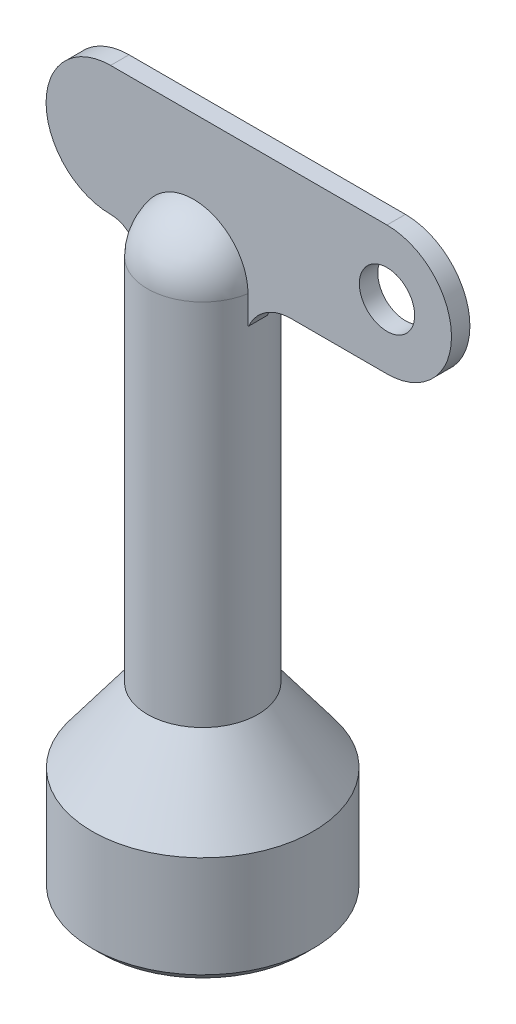
ISO-10303-21;
HEADER;
FILE_DESCRIPTION(('STEP AP214'),'2;1');
FILE_NAME('part.step','',(''),(''),'','','');
FILE_SCHEMA(('AUTOMOTIVE_DESIGN { 1 0 10303 214 1 1 1 1 }'));
ENDSEC;
DATA;
#1=APPLICATION_CONTEXT('core data for automotive mechanical design processes');
#2=APPLICATION_PROTOCOL_DEFINITION('international standard','automotive_design',2000,#1);
#3=PRODUCT_CONTEXT('',#1,'mechanical');
#4=PRODUCT('Part','Part','',(#3));
#5=PRODUCT_RELATED_PRODUCT_CATEGORY('part','',(#4));
#6=PRODUCT_DEFINITION_FORMATION('','',#4);
#7=PRODUCT_DEFINITION_CONTEXT('part definition',#1,'design');
#8=PRODUCT_DEFINITION('design','',#6,#7);
#9=PRODUCT_DEFINITION_SHAPE('','',#8);
#10=(LENGTH_UNIT() NAMED_UNIT(*) SI_UNIT(.MILLI.,.METRE.));
#11=(NAMED_UNIT(*) PLANE_ANGLE_UNIT() SI_UNIT($,.RADIAN.));
#12=(NAMED_UNIT(*) SI_UNIT($,.STERADIAN.) SOLID_ANGLE_UNIT());
#13=UNCERTAINTY_MEASURE_WITH_UNIT(LENGTH_MEASURE(1.E-05),#10,'distance_accuracy_value','');
#14=(GEOMETRIC_REPRESENTATION_CONTEXT(3) GLOBAL_UNCERTAINTY_ASSIGNED_CONTEXT((#13)) GLOBAL_UNIT_ASSIGNED_CONTEXT((#10,
#11,#12)) REPRESENTATION_CONTEXT('',''));
#15=CARTESIAN_POINT('',(0.,0.,0.));
#16=DIRECTION('',(0.,0.,1.));
#17=DIRECTION('',(1.,0.,0.));
#18=AXIS2_PLACEMENT_3D('',#15,#16,#17);
#19=CARTESIAN_POINT('',(0.,24.,0.));
#20=DIRECTION('',(0.,-1.,0.));
#21=DIRECTION('',(-1.,0.,0.));
#22=AXIS2_PLACEMENT_3D('',#19,#20,#21);
#23=SPHERICAL_SURFACE('',#22,3.);
#24=CARTESIAN_POINT('',(0.,24.,-0.5));
#25=DIRECTION('',(0.,0.,1.));
#26=DIRECTION('',(1.,0.,0.));
#27=AXIS2_PLACEMENT_3D('',#24,#25,#26);
#28=CIRCLE('',#27,2.95803989154981);
#29=CARTESIAN_POINT('',(2.95803989154981,24.,-0.5));
#30=VERTEX_POINT('',#29);
#31=CARTESIAN_POINT('',(-2.95803989154981,24.,-0.5));
#32=VERTEX_POINT('',#31);
#33=EDGE_CURVE('E353',#30,#32,#28,.T.);
#34=ORIENTED_EDGE('',*,*,#33,.F.);
#35=CARTESIAN_POINT('',(0.,24.,0.));
#36=DIRECTION('',(0.,1.,0.));
#37=DIRECTION('',(0.,0.,1.));
#38=AXIS2_PLACEMENT_3D('',#35,#36,#37);
#39=CIRCLE('',#38,3.);
#40=EDGE_CURVE('E306',#30,#32,#39,.T.);
#41=ORIENTED_EDGE('',*,*,#40,.T.);
#42=EDGE_LOOP('',(#34,#41));
#43=FACE_BOUND('',#42,.T.);
#44=ADVANCED_FACE('F39',(#43),#23,.T.);
#45=CARTESIAN_POINT('',(0.,-6.,0.));
#46=DIRECTION('',(0.,1.,0.));
#47=DIRECTION('',(0.,0.,1.));
#48=AXIS2_PLACEMENT_3D('',#45,#46,#47);
#49=CYLINDRICAL_SURFACE('',#48,6.);
#50=CARTESIAN_POINT('',(0.,-5.49999999999999,0.));
#51=DIRECTION('',(0.,1.,0.));
#52=DIRECTION('',(0.,0.,1.));
#53=AXIS2_PLACEMENT_3D('',#50,#51,#52);
#54=CIRCLE('',#53,6.);
#55=CARTESIAN_POINT('',(0.,-5.49999999999999,6.));
#56=VERTEX_POINT('',#55);
#57=EDGE_CURVE('E47',#56,#56,#54,.T.);
#58=ORIENTED_EDGE('',*,*,#57,.T.);
#59=EDGE_LOOP('',(#58));
#60=FACE_BOUND('',#59,.T.);
#61=CARTESIAN_POINT('',(0.,0.,0.));
#62=DIRECTION('',(0.,1.,0.));
#63=DIRECTION('',(0.,0.,1.));
#64=AXIS2_PLACEMENT_3D('',#61,#62,#63);
#65=CIRCLE('',#64,6.);
#66=CARTESIAN_POINT('',(0.,0.,6.));
#67=VERTEX_POINT('',#66);
#68=EDGE_CURVE('E349',#67,#67,#65,.T.);
#69=ORIENTED_EDGE('',*,*,#68,.F.);
#70=EDGE_LOOP('',(#69));
#71=FACE_BOUND('',#70,.T.);
#72=ADVANCED_FACE('F402',(#60,#71),#49,.T.);
#73=CARTESIAN_POINT('',(0.,-6.,0.));
#74=DIRECTION('',(0.,1.,0.));
#75=DIRECTION('',(0.,0.,1.));
#76=AXIS2_PLACEMENT_3D('',#73,#74,#75);
#77=PLANE('',#76);
#78=CARTESIAN_POINT('',(0.,-6.,0.));
#79=DIRECTION('',(0.,1.,0.));
#80=DIRECTION('',(0.,0.,1.));
#81=AXIS2_PLACEMENT_3D('',#78,#79,#80);
#82=CIRCLE('',#81,5.5);
#83=CARTESIAN_POINT('',(0.,-6.,5.5));
#84=VERTEX_POINT('',#83);
#85=EDGE_CURVE('E12',#84,#84,#82,.F.);
#86=ORIENTED_EDGE('',*,*,#85,.T.);
#87=EDGE_LOOP('',(#86));
#88=FACE_BOUND('',#87,.T.);
#89=DIRECTION('',(0.500000000000005,0.,-0.866025403784436));
#90=VECTOR('',#89,1.);
#91=CARTESIAN_POINT('',(2.59807621135332,-6.,1.50000000000002));
#92=LINE('',#91,#90);
#93=CARTESIAN_POINT('',(0.606217782649091,-6.,4.95000000000001));
#94=VERTEX_POINT('',#93);
#95=CARTESIAN_POINT('',(4.58993464005755,-6.,-1.94999999999997));
#96=VERTEX_POINT('',#95);
#97=EDGE_CURVE('E374',#94,#96,#92,.T.);
#98=ORIENTED_EDGE('',*,*,#97,.T.);
#99=CARTESIAN_POINT('',(3.98371685740843,-6.,-2.29999999999998));
#100=DIRECTION('',(0.,1.,0.));
#101=DIRECTION('',(0.,0.,1.));
#102=AXIS2_PLACEMENT_3D('',#99,#100,#101);
#103=CIRCLE('',#102,0.700000000000015);
#104=CARTESIAN_POINT('',(3.98371685740844,-6.,-2.99999999999999));
#105=VERTEX_POINT('',#104);
#106=EDGE_CURVE('E379',#96,#105,#103,.T.);
#107=ORIENTED_EDGE('',*,*,#106,.T.);
#108=DIRECTION('',(-1.,0.,0.));
#109=VECTOR('',#108,1.);
#110=CARTESIAN_POINT('',(0.,-6.,-3.00000000000002));
#111=LINE('',#110,#109);
#112=CARTESIAN_POINT('',(-3.9837168574084,-6.,-3.00000000000004));
#113=VERTEX_POINT('',#112);
#114=EDGE_CURVE('E376',#105,#113,#111,.T.);
#115=ORIENTED_EDGE('',*,*,#114,.T.);
#116=CARTESIAN_POINT('',(-3.98371685740841,-6.,-2.30000000000003));
#117=DIRECTION('',(0.,1.,0.));
#118=DIRECTION('',(0.,0.,1.));
#119=AXIS2_PLACEMENT_3D('',#116,#117,#118);
#120=CIRCLE('',#119,0.700000000000015);
#121=CARTESIAN_POINT('',(-4.58993464005753,-6.,-1.95000000000002));
#122=VERTEX_POINT('',#121);
#123=EDGE_CURVE('E370',#113,#122,#120,.T.);
#124=ORIENTED_EDGE('',*,*,#123,.T.);
#125=DIRECTION('',(0.499999999999995,0.,0.866025403784441));
#126=VECTOR('',#125,1.);
#127=CARTESIAN_POINT('',(-2.59807621135334,-6.,1.49999999999999));
#128=LINE('',#127,#126);
#129=CARTESIAN_POINT('',(-0.606217782649152,-6.,4.95));
#130=VERTEX_POINT('',#129);
#131=EDGE_CURVE('E368',#122,#130,#128,.T.);
#132=ORIENTED_EDGE('',*,*,#131,.T.);
#133=CARTESIAN_POINT('',(0.,-6.,4.6));
#134=DIRECTION('',(0.,1.,0.));
#135=DIRECTION('',(0.,0.,1.));
#136=AXIS2_PLACEMENT_3D('',#133,#134,#135);
#137=CIRCLE('',#136,0.700000000000015);
#138=EDGE_CURVE('E372',#130,#94,#137,.T.);
#139=ORIENTED_EDGE('',*,*,#138,.T.);
#140=EDGE_LOOP('',(#98,#107,#115,#124,#132,#139));
#141=FACE_BOUND('',#140,.T.);
#142=ADVANCED_FACE('F329',(#88,#141),#77,.F.);
#143=CARTESIAN_POINT('',(0.,4.,0.));
#144=DIRECTION('',(0.,-1.,0.));
#145=DIRECTION('',(0.,0.,-1.));
#146=AXIS2_PLACEMENT_3D('',#143,#144,#145);
#147=CONICAL_SURFACE('',#146,3.,0.643501108793284);
#148=CARTESIAN_POINT('',(0.,4.,0.));
#149=DIRECTION('',(0.,1.,0.));
#150=DIRECTION('',(0.,0.,1.));
#151=AXIS2_PLACEMENT_3D('',#148,#149,#150);
#152=CIRCLE('',#151,3.);
#153=CARTESIAN_POINT('',(0.,4.,3.));
#154=VERTEX_POINT('',#153);
#155=EDGE_CURVE('E311',#154,#154,#152,.T.);
#156=ORIENTED_EDGE('',*,*,#155,.F.);
#157=EDGE_LOOP('',(#156));
#158=FACE_BOUND('',#157,.T.);
#159=ORIENTED_EDGE('',*,*,#68,.T.);
#160=EDGE_LOOP('',(#159));
#161=FACE_BOUND('',#160,.T.);
#162=ADVANCED_FACE('F318',(#158,#161),#147,.T.);
#163=CARTESIAN_POINT('',(0.,24.,0.));
#164=DIRECTION('',(0.,-1.,0.));
#165=DIRECTION('',(0.,0.,-1.));
#166=AXIS2_PLACEMENT_3D('',#163,#164,#165);
#167=CYLINDRICAL_SURFACE('',#166,3.);
#168=CARTESIAN_POINT('',(-2.95803989154981,24.,0.5));
#169=VERTEX_POINT('',#168);
#170=CARTESIAN_POINT('',(2.95803989154981,24.,0.5));
#171=VERTEX_POINT('',#170);
#172=EDGE_CURVE('E303',#169,#171,#39,.T.);
#173=ORIENTED_EDGE('',*,*,#172,.F.);
#174=DIRECTION('',(0.,-1.,0.));
#175=VECTOR('',#174,1.);
#176=CARTESIAN_POINT('',(-2.95803989154981,24.,0.5));
#177=LINE('',#176,#175);
#178=CARTESIAN_POINT('',(-2.95803989154981,22.5,0.5));
#179=VERTEX_POINT('',#178);
#180=EDGE_CURVE('E301',#169,#179,#177,.T.);
#181=ORIENTED_EDGE('',*,*,#180,.T.);
#182=CARTESIAN_POINT('',(0.,22.5,0.));
#183=DIRECTION('',(0.,1.,0.));
#184=DIRECTION('',(0.,0.,1.));
#185=AXIS2_PLACEMENT_3D('',#182,#183,#184);
#186=CIRCLE('',#185,3.);
#187=CARTESIAN_POINT('',(-3.,22.5,0.));
#188=VERTEX_POINT('',#187);
#189=EDGE_CURVE('E362',#188,#179,#186,.T.);
#190=ORIENTED_EDGE('',*,*,#189,.F.);
#191=CARTESIAN_POINT('',(-2.95803989154981,22.5,-0.5));
#192=VERTEX_POINT('',#191);
#193=EDGE_CURVE('E448',#192,#188,#186,.T.);
#194=ORIENTED_EDGE('',*,*,#193,.F.);
#195=DIRECTION('',(0.,-1.,0.));
#196=VECTOR('',#195,1.);
#197=CARTESIAN_POINT('',(-2.95803989154981,24.,-0.5));
#198=LINE('',#197,#196);
#199=EDGE_CURVE('E296',#32,#192,#198,.T.);
#200=ORIENTED_EDGE('',*,*,#199,.F.);
#201=ORIENTED_EDGE('',*,*,#40,.F.);
#202=DIRECTION('',(0.,-1.,0.));
#203=VECTOR('',#202,1.);
#204=CARTESIAN_POINT('',(2.95803989154981,24.,-0.5));
#205=LINE('',#204,#203);
#206=CARTESIAN_POINT('',(2.95803989154981,22.5,-0.5));
#207=VERTEX_POINT('',#206);
#208=EDGE_CURVE('E293',#207,#30,#205,.F.);
#209=ORIENTED_EDGE('',*,*,#208,.F.);
#210=CARTESIAN_POINT('',(3.,22.5,0.));
#211=VERTEX_POINT('',#210);
#212=EDGE_CURVE('E358',#211,#207,#186,.T.);
#213=ORIENTED_EDGE('',*,*,#212,.F.);
#214=CARTESIAN_POINT('',(2.95803989154981,22.5,0.5));
#215=VERTEX_POINT('',#214);
#216=EDGE_CURVE('E361',#215,#211,#186,.T.);
#217=ORIENTED_EDGE('',*,*,#216,.F.);
#218=DIRECTION('',(0.,-1.,0.));
#219=VECTOR('',#218,1.);
#220=CARTESIAN_POINT('',(2.95803989154981,24.,0.5));
#221=LINE('',#220,#219);
#222=EDGE_CURVE('E299',#215,#171,#221,.F.);
#223=ORIENTED_EDGE('',*,*,#222,.T.);
#224=EDGE_LOOP('',(#173,#181,#190,#194,#200,#201,#209,#213,#217,#223));
#225=FACE_BOUND('',#224,.T.);
#226=ORIENTED_EDGE('',*,*,#155,.T.);
#227=EDGE_LOOP('',(#226));
#228=FACE_BOUND('',#227,.T.);
#229=ADVANCED_FACE('F328',(#225,#228),#167,.T.);
#230=ORIENTED_EDGE('',*,*,#172,.T.);
#231=CARTESIAN_POINT('',(0.,24.,0.5));
#232=DIRECTION('',(0.,0.,1.));
#233=DIRECTION('',(1.,0.,0.));
#234=AXIS2_PLACEMENT_3D('',#231,#232,#233);
#235=CIRCLE('',#234,2.95803989154981);
#236=EDGE_CURVE('E356',#171,#169,#235,.T.);
#237=ORIENTED_EDGE('',*,*,#236,.T.);
#238=EDGE_LOOP('',(#230,#237));
#239=FACE_BOUND('',#238,.T.);
#240=ADVANCED_FACE('F417',(#239),#23,.T.);
#241=CARTESIAN_POINT('',(-3.,22.5,0.5));
#242=DIRECTION('',(0.,1.,0.));
#243=DIRECTION('',(0.,0.,1.));
#244=AXIS2_PLACEMENT_3D('',#241,#242,#243);
#245=PLANE('',#244);
#246=DIRECTION('',(1.,0.,0.));
#247=VECTOR('',#246,1.);
#248=CARTESIAN_POINT('',(-3.,22.5,0.5));
#249=LINE('',#248,#247);
#250=CARTESIAN_POINT('',(3.,22.5,0.5));
#251=VERTEX_POINT('',#250);
#252=EDGE_CURVE('E241',#215,#251,#249,.T.);
#253=ORIENTED_EDGE('',*,*,#252,.F.);
#254=ORIENTED_EDGE('',*,*,#216,.T.);
#255=DIRECTION('',(0.,0.,-1.));
#256=VECTOR('',#255,1.);
#257=CARTESIAN_POINT('',(3.,22.5,0.5));
#258=LINE('',#257,#256);
#259=EDGE_CURVE('E283',#251,#211,#258,.T.);
#260=ORIENTED_EDGE('',*,*,#259,.F.);
#261=EDGE_LOOP('',(#253,#254,#260));
#262=FACE_BOUND('',#261,.T.);
#263=ADVANCED_FACE('F424',(#262),#245,.F.);
#264=CARTESIAN_POINT('',(3.,22.5,-0.5));
#265=VERTEX_POINT('',#264);
#266=EDGE_CURVE('E282',#211,#265,#258,.T.);
#267=ORIENTED_EDGE('',*,*,#266,.F.);
#268=ORIENTED_EDGE('',*,*,#212,.T.);
#269=DIRECTION('',(1.,0.,0.));
#270=VECTOR('',#269,1.);
#271=CARTESIAN_POINT('',(-3.,22.5,-0.5));
#272=LINE('',#271,#270);
#273=EDGE_CURVE('E260',#207,#265,#272,.T.);
#274=ORIENTED_EDGE('',*,*,#273,.T.);
#275=EDGE_LOOP('',(#267,#268,#274));
#276=FACE_BOUND('',#275,.T.);
#277=ADVANCED_FACE('F430',(#276),#245,.F.);
#278=CARTESIAN_POINT('',(-3.,22.5,-0.5));
#279=VERTEX_POINT('',#278);
#280=EDGE_CURVE('E261',#279,#192,#272,.T.);
#281=ORIENTED_EDGE('',*,*,#280,.T.);
#282=ORIENTED_EDGE('',*,*,#193,.T.);
#283=DIRECTION('',(0.,0.,-1.));
#284=VECTOR('',#283,1.);
#285=CARTESIAN_POINT('',(-3.,22.5,0.5));
#286=LINE('',#285,#284);
#287=EDGE_CURVE('E286',#188,#279,#286,.T.);
#288=ORIENTED_EDGE('',*,*,#287,.T.);
#289=EDGE_LOOP('',(#281,#282,#288));
#290=FACE_BOUND('',#289,.T.);
#291=ADVANCED_FACE('F485',(#290),#245,.F.);
#292=CARTESIAN_POINT('',(-4.5,27.5,0.5));
#293=DIRECTION('',(0.,0.,-1.));
#294=DIRECTION('',(-1.,0.,0.));
#295=AXIS2_PLACEMENT_3D('',#292,#293,#294);
#296=CYLINDRICAL_SURFACE('',#295,3.5);
#297=CARTESIAN_POINT('',(-4.5,27.5,-0.5));
#298=DIRECTION('',(0.,0.,1.));
#299=DIRECTION('',(1.,0.,0.));
#300=AXIS2_PLACEMENT_3D('',#297,#298,#299);
#301=CIRCLE('',#300,3.5);
#302=CARTESIAN_POINT('',(-4.5,31.,-0.5));
#303=VERTEX_POINT('',#302);
#304=CARTESIAN_POINT('',(-4.5,24.,-0.5));
#305=VERTEX_POINT('',#304);
#306=EDGE_CURVE('E254',#303,#305,#301,.T.);
#307=ORIENTED_EDGE('',*,*,#306,.T.);
#308=DIRECTION('',(0.,0.,-1.));
#309=VECTOR('',#308,1.);
#310=CARTESIAN_POINT('',(-4.5,24.,0.5));
#311=LINE('',#310,#309);
#312=CARTESIAN_POINT('',(-4.5,24.,0.5));
#313=VERTEX_POINT('',#312);
#314=EDGE_CURVE('E290',#313,#305,#311,.T.);
#315=ORIENTED_EDGE('',*,*,#314,.F.);
#316=CARTESIAN_POINT('',(-4.5,27.5,0.5));
#317=DIRECTION('',(0.,0.,1.));
#318=DIRECTION('',(1.,0.,0.));
#319=AXIS2_PLACEMENT_3D('',#316,#317,#318);
#320=CIRCLE('',#319,3.5);
#321=CARTESIAN_POINT('',(-4.5,31.,0.5));
#322=VERTEX_POINT('',#321);
#323=EDGE_CURVE('E235',#322,#313,#320,.T.);
#324=ORIENTED_EDGE('',*,*,#323,.F.);
#325=DIRECTION('',(0.,0.,-1.));
#326=VECTOR('',#325,1.);
#327=CARTESIAN_POINT('',(-4.5,31.,0.5));
#328=LINE('',#327,#326);
#329=EDGE_CURVE('E253',#322,#303,#328,.T.);
#330=ORIENTED_EDGE('',*,*,#329,.T.);
#331=EDGE_LOOP('',(#307,#315,#324,#330));
#332=FACE_BOUND('',#331,.T.);
#333=ADVANCED_FACE('F480',(#332),#296,.T.);
#334=CARTESIAN_POINT('',(-4.5,22.5,0.5));
#335=DIRECTION('',(0.,0.,-1.));
#336=DIRECTION('',(-1.,0.,0.));
#337=AXIS2_PLACEMENT_3D('',#334,#335,#336);
#338=CYLINDRICAL_SURFACE('',#337,1.5);
#339=CARTESIAN_POINT('',(-4.5,22.5,-0.5));
#340=DIRECTION('',(0.,0.,-1.));
#341=DIRECTION('',(1.,0.,0.));
#342=AXIS2_PLACEMENT_3D('',#339,#340,#341);
#343=CIRCLE('',#342,1.5);
#344=EDGE_CURVE('E257',#305,#279,#343,.T.);
#345=ORIENTED_EDGE('',*,*,#344,.T.);
#346=ORIENTED_EDGE('',*,*,#287,.F.);
#347=CARTESIAN_POINT('',(-3.,22.5,0.5));
#348=VERTEX_POINT('',#347);
#349=EDGE_CURVE('E287',#348,#188,#286,.T.);
#350=ORIENTED_EDGE('',*,*,#349,.F.);
#351=CARTESIAN_POINT('',(-4.5,22.5,0.5));
#352=DIRECTION('',(0.,0.,-1.));
#353=DIRECTION('',(1.,0.,0.));
#354=AXIS2_PLACEMENT_3D('',#351,#352,#353);
#355=CIRCLE('',#354,1.5);
#356=EDGE_CURVE('E238',#313,#348,#355,.T.);
#357=ORIENTED_EDGE('',*,*,#356,.F.);
#358=ORIENTED_EDGE('',*,*,#314,.T.);
#359=EDGE_LOOP('',(#345,#346,#350,#357,#358));
#360=FACE_BOUND('',#359,.T.);
#361=ADVANCED_FACE('F483',(#360),#338,.F.);
#362=ORIENTED_EDGE('',*,*,#349,.T.);
#363=ORIENTED_EDGE('',*,*,#189,.T.);
#364=EDGE_CURVE('E242',#348,#179,#249,.T.);
#365=ORIENTED_EDGE('',*,*,#364,.F.);
#366=EDGE_LOOP('',(#362,#363,#365));
#367=FACE_BOUND('',#366,.T.);
#368=ADVANCED_FACE('F433',(#367),#245,.F.);
#369=CARTESIAN_POINT('',(5.29128784747792,21.5,0.5));
#370=DIRECTION('',(0.,0.,-1.));
#371=DIRECTION('',(-1.,0.,0.));
#372=AXIS2_PLACEMENT_3D('',#369,#370,#371);
#373=CYLINDRICAL_SURFACE('',#372,2.5);
#374=CARTESIAN_POINT('',(5.29128784747792,21.5,-0.5));
#375=DIRECTION('',(0.,0.,-1.));
#376=DIRECTION('',(1.,0.,0.));
#377=AXIS2_PLACEMENT_3D('',#374,#375,#376);
#378=CIRCLE('',#377,2.5);
#379=CARTESIAN_POINT('',(5.29128784747792,24.,-0.5));
#380=VERTEX_POINT('',#379);
#381=EDGE_CURVE('E264',#265,#380,#378,.T.);
#382=ORIENTED_EDGE('',*,*,#381,.T.);
#383=DIRECTION('',(0.,0.,-1.));
#384=VECTOR('',#383,1.);
#385=CARTESIAN_POINT('',(5.29128784747792,24.,0.5));
#386=LINE('',#385,#384);
#387=CARTESIAN_POINT('',(5.29128784747792,24.,0.5));
#388=VERTEX_POINT('',#387);
#389=EDGE_CURVE('E279',#388,#380,#386,.T.);
#390=ORIENTED_EDGE('',*,*,#389,.F.);
#391=CARTESIAN_POINT('',(5.29128784747792,21.5,0.5));
#392=DIRECTION('',(0.,0.,-1.));
#393=DIRECTION('',(1.,0.,0.));
#394=AXIS2_PLACEMENT_3D('',#391,#392,#393);
#395=CIRCLE('',#394,2.5);
#396=EDGE_CURVE('E245',#251,#388,#395,.T.);
#397=ORIENTED_EDGE('',*,*,#396,.F.);
#398=ORIENTED_EDGE('',*,*,#259,.T.);
#399=ORIENTED_EDGE('',*,*,#266,.T.);
#400=EDGE_LOOP('',(#382,#390,#397,#398,#399));
#401=FACE_BOUND('',#400,.T.);
#402=ADVANCED_FACE('F460',(#401),#373,.F.);
#403=CARTESIAN_POINT('',(5.29128784747792,24.,0.5));
#404=DIRECTION('',(0.,1.,0.));
#405=DIRECTION('',(0.,0.,1.));
#406=AXIS2_PLACEMENT_3D('',#403,#404,#405);
#407=PLANE('',#406);
#408=DIRECTION('',(1.,0.,0.));
#409=VECTOR('',#408,1.);
#410=CARTESIAN_POINT('',(5.29128784747792,24.,-0.5));
#411=LINE('',#410,#409);
#412=CARTESIAN_POINT('',(10.5,24.,-0.5));
#413=VERTEX_POINT('',#412);
#414=EDGE_CURVE('E266',#380,#413,#411,.T.);
#415=ORIENTED_EDGE('',*,*,#414,.T.);
#416=DIRECTION('',(0.,0.,-1.));
#417=VECTOR('',#416,1.);
#418=CARTESIAN_POINT('',(10.5,24.,0.5));
#419=LINE('',#418,#417);
#420=CARTESIAN_POINT('',(10.5,24.,0.5));
#421=VERTEX_POINT('',#420);
#422=EDGE_CURVE('E276',#421,#413,#419,.T.);
#423=ORIENTED_EDGE('',*,*,#422,.F.);
#424=DIRECTION('',(1.,0.,0.));
#425=VECTOR('',#424,1.);
#426=CARTESIAN_POINT('',(5.29128784747792,24.,0.5));
#427=LINE('',#426,#425);
#428=EDGE_CURVE('E247',#388,#421,#427,.T.);
#429=ORIENTED_EDGE('',*,*,#428,.F.);
#430=ORIENTED_EDGE('',*,*,#389,.T.);
#431=EDGE_LOOP('',(#415,#423,#429,#430));
#432=FACE_BOUND('',#431,.T.);
#433=ADVANCED_FACE('F467',(#432),#407,.F.);
#434=CARTESIAN_POINT('',(10.5,27.5,0.5));
#435=DIRECTION('',(0.,0.,-1.));
#436=DIRECTION('',(-1.,0.,0.));
#437=AXIS2_PLACEMENT_3D('',#434,#435,#436);
#438=CYLINDRICAL_SURFACE('',#437,3.50000000000001);
#439=CARTESIAN_POINT('',(10.5,27.5,-0.5));
#440=DIRECTION('',(0.,0.,1.));
#441=DIRECTION('',(-1.,0.,0.));
#442=AXIS2_PLACEMENT_3D('',#439,#440,#441);
#443=CIRCLE('',#442,3.50000000000001);
#444=CARTESIAN_POINT('',(10.5,31.,-0.5));
#445=VERTEX_POINT('',#444);
#446=EDGE_CURVE('E268',#413,#445,#443,.T.);
#447=ORIENTED_EDGE('',*,*,#446,.T.);
#448=DIRECTION('',(0.,0.,-1.));
#449=VECTOR('',#448,1.);
#450=CARTESIAN_POINT('',(10.5,31.,0.5));
#451=LINE('',#450,#449);
#452=CARTESIAN_POINT('',(10.5,31.,0.5));
#453=VERTEX_POINT('',#452);
#454=EDGE_CURVE('E273',#453,#445,#451,.T.);
#455=ORIENTED_EDGE('',*,*,#454,.F.);
#456=CARTESIAN_POINT('',(10.5,27.5,0.5));
#457=DIRECTION('',(0.,0.,1.));
#458=DIRECTION('',(-1.,0.,0.));
#459=AXIS2_PLACEMENT_3D('',#456,#457,#458);
#460=CIRCLE('',#459,3.50000000000001);
#461=EDGE_CURVE('E249',#421,#453,#460,.T.);
#462=ORIENTED_EDGE('',*,*,#461,.F.);
#463=ORIENTED_EDGE('',*,*,#422,.T.);
#464=EDGE_LOOP('',(#447,#455,#462,#463));
#465=FACE_BOUND('',#464,.T.);
#466=ADVANCED_FACE('F471',(#465),#438,.T.);
#467=CARTESIAN_POINT('',(10.5,31.,0.5));
#468=DIRECTION('',(0.,-1.,0.));
#469=DIRECTION('',(1.,0.,0.));
#470=AXIS2_PLACEMENT_3D('',#467,#468,#469);
#471=PLANE('',#470);
#472=DIRECTION('',(-1.,0.,0.));
#473=VECTOR('',#472,1.);
#474=CARTESIAN_POINT('',(10.5,31.,-0.5));
#475=LINE('',#474,#473);
#476=EDGE_CURVE('E239',#445,#303,#475,.T.);
#477=ORIENTED_EDGE('',*,*,#476,.T.);
#478=ORIENTED_EDGE('',*,*,#329,.F.);
#479=DIRECTION('',(-1.,0.,0.));
#480=VECTOR('',#479,1.);
#481=CARTESIAN_POINT('',(10.5,31.,0.5));
#482=LINE('',#481,#480);
#483=EDGE_CURVE('E251',#453,#322,#482,.T.);
#484=ORIENTED_EDGE('',*,*,#483,.F.);
#485=ORIENTED_EDGE('',*,*,#454,.T.);
#486=EDGE_LOOP('',(#477,#478,#484,#485));
#487=FACE_BOUND('',#486,.T.);
#488=ADVANCED_FACE('F476',(#487),#471,.F.);
#489=CARTESIAN_POINT('',(-4.5,27.5,0.5));
#490=DIRECTION('',(0.,0.,1.));
#491=DIRECTION('',(1.,0.,0.));
#492=AXIS2_PLACEMENT_3D('',#489,#490,#491);
#493=PLANE('',#492);
#494=CARTESIAN_POINT('',(10.5,27.5,0.5));
#495=DIRECTION('',(0.,0.,1.));
#496=DIRECTION('',(1.,0.,0.));
#497=AXIS2_PLACEMENT_3D('',#494,#495,#496);
#498=CIRCLE('',#497,1.5);
#499=CARTESIAN_POINT('',(12.,27.5,0.5));
#500=VERTEX_POINT('',#499);
#501=EDGE_CURVE('E223',#500,#500,#498,.T.);
#502=ORIENTED_EDGE('',*,*,#501,.F.);
#503=EDGE_LOOP('',(#502));
#504=FACE_BOUND('',#503,.T.);
#505=ORIENTED_EDGE('',*,*,#180,.F.);
#506=ORIENTED_EDGE('',*,*,#236,.F.);
#507=ORIENTED_EDGE('',*,*,#222,.F.);
#508=ORIENTED_EDGE('',*,*,#252,.T.);
#509=ORIENTED_EDGE('',*,*,#396,.T.);
#510=ORIENTED_EDGE('',*,*,#428,.T.);
#511=ORIENTED_EDGE('',*,*,#461,.T.);
#512=ORIENTED_EDGE('',*,*,#483,.T.);
#513=ORIENTED_EDGE('',*,*,#323,.T.);
#514=ORIENTED_EDGE('',*,*,#356,.T.);
#515=ORIENTED_EDGE('',*,*,#364,.T.);
#516=EDGE_LOOP('',(#505,#506,#507,#508,#509,#510,#511,#512,#513,#514,#515));
#517=FACE_BOUND('',#516,.T.);
#518=ADVANCED_FACE('F440',(#504,#517),#493,.T.);
#519=CARTESIAN_POINT('',(-4.5,27.5,-0.5));
#520=DIRECTION('',(0.,0.,1.));
#521=DIRECTION('',(1.,0.,0.));
#522=AXIS2_PLACEMENT_3D('',#519,#520,#521);
#523=PLANE('',#522);
#524=CARTESIAN_POINT('',(10.5,27.5,-0.5));
#525=DIRECTION('',(0.,0.,1.));
#526=DIRECTION('',(1.,0.,0.));
#527=AXIS2_PLACEMENT_3D('',#524,#525,#526);
#528=CIRCLE('',#527,1.5);
#529=CARTESIAN_POINT('',(12.,27.5,-0.5));
#530=VERTEX_POINT('',#529);
#531=EDGE_CURVE('E234',#530,#530,#528,.T.);
#532=ORIENTED_EDGE('',*,*,#531,.T.);
#533=EDGE_LOOP('',(#532));
#534=FACE_BOUND('',#533,.T.);
#535=ORIENTED_EDGE('',*,*,#33,.T.);
#536=ORIENTED_EDGE('',*,*,#199,.T.);
#537=ORIENTED_EDGE('',*,*,#280,.F.);
#538=ORIENTED_EDGE('',*,*,#344,.F.);
#539=ORIENTED_EDGE('',*,*,#306,.F.);
#540=ORIENTED_EDGE('',*,*,#476,.F.);
#541=ORIENTED_EDGE('',*,*,#446,.F.);
#542=ORIENTED_EDGE('',*,*,#414,.F.);
#543=ORIENTED_EDGE('',*,*,#381,.F.);
#544=ORIENTED_EDGE('',*,*,#273,.F.);
#545=ORIENTED_EDGE('',*,*,#208,.T.);
#546=EDGE_LOOP('',(#535,#536,#537,#538,#539,#540,#541,#542,#543,#544,#545));
#547=FACE_BOUND('',#546,.T.);
#548=ADVANCED_FACE('F487',(#534,#547),#523,.F.);
#549=CARTESIAN_POINT('',(10.5,27.5,-6.0001));
#550=DIRECTION('',(0.,0.,1.));
#551=DIRECTION('',(1.,0.,0.));
#552=AXIS2_PLACEMENT_3D('',#549,#550,#551);
#553=CYLINDRICAL_SURFACE('',#552,1.5);
#554=ORIENTED_EDGE('',*,*,#501,.T.);
#555=EDGE_LOOP('',(#554));
#556=FACE_BOUND('',#555,.T.);
#557=ORIENTED_EDGE('',*,*,#531,.F.);
#558=EDGE_LOOP('',(#557));
#559=FACE_BOUND('',#558,.T.);
#560=ADVANCED_FACE('F491',(#556,#559),#553,.F.);
#561=CARTESIAN_POINT('',(3.98371685740843,-1.,-2.29999999999998));
#562=DIRECTION('',(0.,-1.,0.));
#563=DIRECTION('',(0.,0.,-1.));
#564=AXIS2_PLACEMENT_3D('',#561,#562,#563);
#565=CYLINDRICAL_SURFACE('',#564,0.2);
#566=DIRECTION('',(0.,-1.,0.));
#567=VECTOR('',#566,1.);
#568=CARTESIAN_POINT('',(3.98371685740843,-1.,-2.49999999999998));
#569=LINE('',#568,#567);
#570=CARTESIAN_POINT('',(3.98371685740843,-1.,-2.49999999999998));
#571=VERTEX_POINT('',#570);
#572=CARTESIAN_POINT('',(3.98371685740843,-5.71132486540518,-2.49999999999998));
#573=VERTEX_POINT('',#572);
#574=EDGE_CURVE('E221',#571,#573,#569,.T.);
#575=ORIENTED_EDGE('',*,*,#574,.T.);
#576=CARTESIAN_POINT('',(3.98371685740843,-5.71132486540518,-2.29999999999998));
#577=DIRECTION('',(0.,1.,0.));
#578=DIRECTION('',(0.,0.,1.));
#579=AXIS2_PLACEMENT_3D('',#576,#577,#578);
#580=CIRCLE('',#579,0.2);
#581=CARTESIAN_POINT('',(4.15692193816532,-5.71132486540518,-2.19999999999998));
#582=VERTEX_POINT('',#581);
#583=EDGE_CURVE('E191',#573,#582,#580,.F.);
#584=ORIENTED_EDGE('',*,*,#583,.T.);
#585=DIRECTION('',(0.,-1.,0.));
#586=VECTOR('',#585,1.);
#587=CARTESIAN_POINT('',(4.15692193816532,-1.,-2.19999999999998));
#588=LINE('',#587,#586);
#589=CARTESIAN_POINT('',(4.15692193816532,-1.,-2.19999999999998));
#590=VERTEX_POINT('',#589);
#591=EDGE_CURVE('E183',#590,#582,#588,.T.);
#592=ORIENTED_EDGE('',*,*,#591,.F.);
#593=CARTESIAN_POINT('',(3.98371685740843,-1.,-2.29999999999998));
#594=DIRECTION('',(0.,-1.,0.));
#595=DIRECTION('',(0.,0.,1.));
#596=AXIS2_PLACEMENT_3D('',#593,#594,#595);
#597=CIRCLE('',#596,0.2);
#598=EDGE_CURVE('E188',#571,#590,#597,.T.);
#599=ORIENTED_EDGE('',*,*,#598,.F.);
#600=EDGE_LOOP('',(#575,#584,#592,#599));
#601=FACE_BOUND('',#600,.T.);
#602=ADVANCED_FACE('F186',(#601),#565,.F.);
#603=CARTESIAN_POINT('',(-3.98371685740841,-1.,-2.50000000000003));
#604=DIRECTION('',(0.,0.,-1.));
#605=DIRECTION('',(-1.,0.,0.));
#606=AXIS2_PLACEMENT_3D('',#603,#604,#605);
#607=PLANE('',#606);
#608=DIRECTION('',(0.,-1.,0.));
#609=VECTOR('',#608,1.);
#610=CARTESIAN_POINT('',(-3.98371685740841,-1.,-2.50000000000003));
#611=LINE('',#610,#609);
#612=CARTESIAN_POINT('',(-3.98371685740841,-1.,-2.50000000000003));
#613=VERTEX_POINT('',#612);
#614=CARTESIAN_POINT('',(-3.98371685740841,-5.71132486540518,-2.50000000000003));
#615=VERTEX_POINT('',#614);
#616=EDGE_CURVE('E224',#613,#615,#611,.T.);
#617=ORIENTED_EDGE('',*,*,#616,.T.);
#618=DIRECTION('',(1.,0.,0.));
#619=VECTOR('',#618,1.);
#620=CARTESIAN_POINT('',(-3.98371685740841,-5.71132486540518,-2.50000000000003));
#621=LINE('',#620,#619);
#622=EDGE_CURVE('E365',#615,#573,#621,.T.);
#623=ORIENTED_EDGE('',*,*,#622,.T.);
#624=ORIENTED_EDGE('',*,*,#574,.F.);
#625=DIRECTION('',(1.,0.,0.));
#626=VECTOR('',#625,1.);
#627=CARTESIAN_POINT('',(-3.98371685740841,-1.,-2.50000000000003));
#628=LINE('',#627,#626);
#629=EDGE_CURVE('E195',#613,#571,#628,.T.);
#630=ORIENTED_EDGE('',*,*,#629,.F.);
#631=EDGE_LOOP('',(#617,#623,#624,#630));
#632=FACE_BOUND('',#631,.T.);
#633=ADVANCED_FACE('F652',(#632),#607,.F.);
#634=CARTESIAN_POINT('',(-3.98371685740841,-1.,-2.30000000000003));
#635=DIRECTION('',(0.,-1.,0.));
#636=DIRECTION('',(0.,0.,-1.));
#637=AXIS2_PLACEMENT_3D('',#634,#635,#636);
#638=CYLINDRICAL_SURFACE('',#637,0.2);
#639=DIRECTION('',(0.,-1.,0.));
#640=VECTOR('',#639,1.);
#641=CARTESIAN_POINT('',(-4.1569219381653,-1.,-2.20000000000003));
#642=LINE('',#641,#640);
#643=CARTESIAN_POINT('',(-4.1569219381653,-1.,-2.20000000000003));
#644=VERTEX_POINT('',#643);
#645=CARTESIAN_POINT('',(-4.1569219381653,-5.71132486540518,-2.20000000000003));
#646=VERTEX_POINT('',#645);
#647=EDGE_CURVE('E227',#644,#646,#642,.T.);
#648=ORIENTED_EDGE('',*,*,#647,.T.);
#649=CARTESIAN_POINT('',(-3.98371685740841,-5.71132486540518,-2.30000000000003));
#650=DIRECTION('',(0.,1.,0.));
#651=DIRECTION('',(0.,0.,1.));
#652=AXIS2_PLACEMENT_3D('',#649,#650,#651);
#653=CIRCLE('',#652,0.2);
#654=EDGE_CURVE('E385',#646,#615,#653,.F.);
#655=ORIENTED_EDGE('',*,*,#654,.T.);
#656=ORIENTED_EDGE('',*,*,#616,.F.);
#657=CARTESIAN_POINT('',(-3.98371685740841,-1.,-2.30000000000003));
#658=DIRECTION('',(0.,-1.,0.));
#659=DIRECTION('',(0.,0.,1.));
#660=AXIS2_PLACEMENT_3D('',#657,#658,#659);
#661=CIRCLE('',#660,0.2);
#662=EDGE_CURVE('E218',#644,#613,#661,.T.);
#663=ORIENTED_EDGE('',*,*,#662,.F.);
#664=EDGE_LOOP('',(#648,#655,#656,#663));
#665=FACE_BOUND('',#664,.T.);
#666=ADVANCED_FACE('F643',(#665),#638,.F.);
#667=CARTESIAN_POINT('',(-0.173205080756916,-1.,4.7));
#668=DIRECTION('',(-0.866025403784442,0.,0.499999999999995));
#669=DIRECTION('',(0.499999999999995,0.,0.866025403784442));
#670=AXIS2_PLACEMENT_3D('',#667,#668,#669);
#671=PLANE('',#670);
#672=DIRECTION('',(0.,-1.,0.));
#673=VECTOR('',#672,1.);
#674=CARTESIAN_POINT('',(-0.173205080756916,-1.,4.7));
#675=LINE('',#674,#673);
#676=CARTESIAN_POINT('',(-0.173205080756916,-1.,4.7));
#677=VERTEX_POINT('',#676);
#678=CARTESIAN_POINT('',(-0.173205080756916,-5.71132486540518,4.7));
#679=VERTEX_POINT('',#678);
#680=EDGE_CURVE('E229',#677,#679,#675,.T.);
#681=ORIENTED_EDGE('',*,*,#680,.T.);
#682=DIRECTION('',(-0.499999999999995,0.,-0.866025403784442));
#683=VECTOR('',#682,1.);
#684=CARTESIAN_POINT('',(-0.173205080756916,-5.71132486540518,4.7));
#685=LINE('',#684,#683);
#686=EDGE_CURVE('E54',#679,#646,#685,.T.);
#687=ORIENTED_EDGE('',*,*,#686,.T.);
#688=ORIENTED_EDGE('',*,*,#647,.F.);
#689=DIRECTION('',(-0.499999999999995,0.,-0.866025403784442));
#690=VECTOR('',#689,1.);
#691=CARTESIAN_POINT('',(-0.173205080756916,-1.,4.7));
#692=LINE('',#691,#690);
#693=EDGE_CURVE('E215',#677,#644,#692,.T.);
#694=ORIENTED_EDGE('',*,*,#693,.F.);
#695=EDGE_LOOP('',(#681,#687,#688,#694));
#696=FACE_BOUND('',#695,.T.);
#697=ADVANCED_FACE('F634',(#696),#671,.F.);
#698=CARTESIAN_POINT('',(0.,-1.,4.6));
#699=DIRECTION('',(0.,-1.,0.));
#700=DIRECTION('',(0.,0.,-1.));
#701=AXIS2_PLACEMENT_3D('',#698,#699,#700);
#702=CYLINDRICAL_SURFACE('',#701,0.199999999999999);
#703=DIRECTION('',(0.,-1.,0.));
#704=VECTOR('',#703,1.);
#705=CARTESIAN_POINT('',(0.17320508075686,-1.,4.7));
#706=LINE('',#705,#704);
#707=CARTESIAN_POINT('',(0.17320508075686,-1.,4.7));
#708=VERTEX_POINT('',#707);
#709=CARTESIAN_POINT('',(0.17320508075686,-5.71132486540518,4.7));
#710=VERTEX_POINT('',#709);
#711=EDGE_CURVE('E194',#708,#710,#706,.T.);
#712=ORIENTED_EDGE('',*,*,#711,.T.);
#713=CARTESIAN_POINT('',(0.,-5.71132486540518,4.6));
#714=DIRECTION('',(0.,1.,0.));
#715=DIRECTION('',(0.,0.,1.));
#716=AXIS2_PLACEMENT_3D('',#713,#714,#715);
#717=CIRCLE('',#716,0.199999999999999);
#718=EDGE_CURVE('E62',#710,#679,#717,.F.);
#719=ORIENTED_EDGE('',*,*,#718,.T.);
#720=ORIENTED_EDGE('',*,*,#680,.F.);
#721=CARTESIAN_POINT('',(0.,-1.,4.6));
#722=DIRECTION('',(0.,-1.,0.));
#723=DIRECTION('',(0.,0.,-1.));
#724=AXIS2_PLACEMENT_3D('',#721,#722,#723);
#725=CIRCLE('',#724,0.199999999999999);
#726=EDGE_CURVE('E203',#708,#677,#725,.T.);
#727=ORIENTED_EDGE('',*,*,#726,.F.);
#728=EDGE_LOOP('',(#712,#719,#720,#727));
#729=FACE_BOUND('',#728,.T.);
#730=ADVANCED_FACE('F625',(#729),#702,.F.);
#731=CARTESIAN_POINT('',(4.15692193816532,-1.,-2.19999999999998));
#732=DIRECTION('',(0.866025403784436,0.,0.500000000000005));
#733=DIRECTION('',(0.500000000000005,0.,-0.866025403784436));
#734=AXIS2_PLACEMENT_3D('',#731,#732,#733);
#735=PLANE('',#734);
#736=ORIENTED_EDGE('',*,*,#591,.T.);
#737=DIRECTION('',(-0.500000000000005,0.,0.866025403784436));
#738=VECTOR('',#737,1.);
#739=CARTESIAN_POINT('',(4.15692193816532,-5.71132486540518,-2.19999999999998));
#740=LINE('',#739,#738);
#741=EDGE_CURVE('E381',#582,#710,#740,.T.);
#742=ORIENTED_EDGE('',*,*,#741,.T.);
#743=ORIENTED_EDGE('',*,*,#711,.F.);
#744=DIRECTION('',(-0.500000000000005,0.,0.866025403784436));
#745=VECTOR('',#744,1.);
#746=CARTESIAN_POINT('',(4.15692193816532,-1.,-2.19999999999998));
#747=LINE('',#746,#745);
#748=EDGE_CURVE('E198',#590,#708,#747,.T.);
#749=ORIENTED_EDGE('',*,*,#748,.F.);
#750=EDGE_LOOP('',(#736,#742,#743,#749));
#751=FACE_BOUND('',#750,.T.);
#752=ADVANCED_FACE('F199',(#751),#735,.F.);
#753=CARTESIAN_POINT('',(3.98371685740843,-1.,-2.29999999999998));
#754=DIRECTION('',(0.,1.,0.));
#755=DIRECTION('',(0.,0.,1.));
#756=AXIS2_PLACEMENT_3D('',#753,#754,#755);
#757=PLANE('',#756);
#758=ORIENTED_EDGE('',*,*,#598,.T.);
#759=ORIENTED_EDGE('',*,*,#748,.T.);
#760=ORIENTED_EDGE('',*,*,#726,.T.);
#761=ORIENTED_EDGE('',*,*,#693,.T.);
#762=ORIENTED_EDGE('',*,*,#662,.T.);
#763=ORIENTED_EDGE('',*,*,#629,.T.);
#764=EDGE_LOOP('',(#758,#759,#760,#761,#762,#763));
#765=FACE_BOUND('',#764,.T.);
#766=ADVANCED_FACE('F205',(#765),#757,.F.);
#767=CARTESIAN_POINT('',(0.,-5.71132486540518,4.6));
#768=DIRECTION('',(0.,-1.,0.));
#769=DIRECTION('',(0.,0.,-1.));
#770=AXIS2_PLACEMENT_3D('',#767,#768,#769);
#771=CONICAL_SURFACE('',#770,0.199999999999999,1.04719755119661);
#772=DIRECTION('',(-0.750000000000002,0.499999999999993,-0.433012701892225));
#773=VECTOR('',#772,1.);
#774=CARTESIAN_POINT('',(0.606217782649091,-6.,4.95000000000001));
#775=LINE('',#774,#773);
#776=EDGE_CURVE('E211',#94,#710,#775,.T.);
#777=ORIENTED_EDGE('',*,*,#776,.F.);
#778=ORIENTED_EDGE('',*,*,#138,.F.);
#779=DIRECTION('',(-0.750000000000009,-0.499999999999993,0.433012701892213));
#780=VECTOR('',#779,1.);
#781=CARTESIAN_POINT('',(-0.173205080756916,-5.71132486540518,4.7));
#782=LINE('',#781,#780);
#783=EDGE_CURVE('E208',#679,#130,#782,.T.);
#784=ORIENTED_EDGE('',*,*,#783,.F.);
#785=ORIENTED_EDGE('',*,*,#718,.F.);
#786=EDGE_LOOP('',(#777,#778,#784,#785));
#787=FACE_BOUND('',#786,.T.);
#788=ADVANCED_FACE('F605',(#787),#771,.F.);
#789=CARTESIAN_POINT('',(-0.173205080756916,-5.71132486540518,4.7));
#790=DIRECTION('',(-0.433012701892215,0.866025403784443,0.249999999999994));
#791=DIRECTION('',(-0.499999999999995,0.,-0.866025403784442));
#792=AXIS2_PLACEMENT_3D('',#789,#790,#791);
#793=PLANE('',#792);
#794=ORIENTED_EDGE('',*,*,#783,.T.);
#795=ORIENTED_EDGE('',*,*,#131,.F.);
#796=DIRECTION('',(-0.750000000000004,-0.499999999999993,0.43301270189222));
#797=VECTOR('',#796,1.);
#798=CARTESIAN_POINT('',(-4.1569219381653,-5.71132486540518,-2.20000000000003));
#799=LINE('',#798,#797);
#800=EDGE_CURVE('E395',#646,#122,#799,.T.);
#801=ORIENTED_EDGE('',*,*,#800,.F.);
#802=ORIENTED_EDGE('',*,*,#686,.F.);
#803=EDGE_LOOP('',(#794,#795,#801,#802));
#804=FACE_BOUND('',#803,.T.);
#805=ADVANCED_FACE('F595',(#804),#793,.F.);
#806=CARTESIAN_POINT('',(4.15692193816532,-5.71132486540518,-2.19999999999998));
#807=DIRECTION('',(0.433012701892214,0.866025403784441,0.25));
#808=DIRECTION('',(-0.500000000000005,0.,0.866025403784436));
#809=AXIS2_PLACEMENT_3D('',#806,#807,#808);
#810=PLANE('',#809);
#811=ORIENTED_EDGE('',*,*,#776,.T.);
#812=ORIENTED_EDGE('',*,*,#741,.F.);
#813=DIRECTION('',(-0.75,0.499999999999995,-0.433012701892225));
#814=VECTOR('',#813,1.);
#815=CARTESIAN_POINT('',(4.58993464005755,-6.,-1.94999999999997));
#816=LINE('',#815,#814);
#817=EDGE_CURVE('E392',#96,#582,#816,.T.);
#818=ORIENTED_EDGE('',*,*,#817,.F.);
#819=ORIENTED_EDGE('',*,*,#97,.F.);
#820=EDGE_LOOP('',(#811,#812,#818,#819));
#821=FACE_BOUND('',#820,.T.);
#822=ADVANCED_FACE('F585',(#821),#810,.F.);
#823=CARTESIAN_POINT('',(-3.98371685740841,-5.71132486540518,-2.30000000000003));
#824=DIRECTION('',(0.,-1.,0.));
#825=DIRECTION('',(0.,0.,-1.));
#826=AXIS2_PLACEMENT_3D('',#823,#824,#825);
#827=CONICAL_SURFACE('',#826,0.2,1.04719755119661);
#828=ORIENTED_EDGE('',*,*,#800,.T.);
#829=ORIENTED_EDGE('',*,*,#123,.F.);
#830=DIRECTION('',(0.,-0.499999999999993,-0.866025403784443));
#831=VECTOR('',#830,1.);
#832=CARTESIAN_POINT('',(-3.98371685740841,-5.71132486540518,-2.50000000000003));
#833=LINE('',#832,#831);
#834=EDGE_CURVE('E390',#615,#113,#833,.T.);
#835=ORIENTED_EDGE('',*,*,#834,.F.);
#836=ORIENTED_EDGE('',*,*,#654,.F.);
#837=EDGE_LOOP('',(#828,#829,#835,#836));
#838=FACE_BOUND('',#837,.T.);
#839=ADVANCED_FACE('F575',(#838),#827,.F.);
#840=CARTESIAN_POINT('',(3.98371685740843,-5.71132486540518,-2.29999999999998));
#841=DIRECTION('',(0.,-1.,0.));
#842=DIRECTION('',(0.,0.,-1.));
#843=AXIS2_PLACEMENT_3D('',#840,#841,#842);
#844=CONICAL_SURFACE('',#843,0.2,1.04719755119661);
#845=ORIENTED_EDGE('',*,*,#817,.T.);
#846=ORIENTED_EDGE('',*,*,#583,.F.);
#847=DIRECTION('',(0.,0.499999999999993,0.866025403784443));
#848=VECTOR('',#847,1.);
#849=CARTESIAN_POINT('',(3.98371685740844,-6.,-2.99999999999999));
#850=LINE('',#849,#848);
#851=EDGE_CURVE('E388',#105,#573,#850,.T.);
#852=ORIENTED_EDGE('',*,*,#851,.F.);
#853=ORIENTED_EDGE('',*,*,#106,.F.);
#854=EDGE_LOOP('',(#845,#846,#852,#853));
#855=FACE_BOUND('',#854,.T.);
#856=ADVANCED_FACE('F411',(#855),#844,.F.);
#857=CARTESIAN_POINT('',(-3.98371685740841,-5.71132486540518,-2.50000000000003));
#858=DIRECTION('',(0.,0.86602540378444,-0.499999999999998));
#859=DIRECTION('',(1.,0.,0.));
#860=AXIS2_PLACEMENT_3D('',#857,#858,#859);
#861=PLANE('',#860);
#862=ORIENTED_EDGE('',*,*,#834,.T.);
#863=ORIENTED_EDGE('',*,*,#114,.F.);
#864=ORIENTED_EDGE('',*,*,#851,.T.);
#865=ORIENTED_EDGE('',*,*,#622,.F.);
#866=EDGE_LOOP('',(#862,#863,#864,#865));
#867=FACE_BOUND('',#866,.T.);
#868=ADVANCED_FACE('F406',(#867),#861,.F.);
#869=CARTESIAN_POINT('',(0.,-5.49999999999999,0.));
#870=DIRECTION('',(0.,1.,0.));
#871=DIRECTION('',(0.,0.,1.));
#872=AXIS2_PLACEMENT_3D('',#869,#870,#871);
#873=CONICAL_SURFACE('',#872,6.,0.785398163397445);
#874=ORIENTED_EDGE('',*,*,#85,.F.);
#875=EDGE_LOOP('',(#874));
#876=FACE_BOUND('',#875,.T.);
#877=ORIENTED_EDGE('',*,*,#57,.F.);
#878=EDGE_LOOP('',(#877));
#879=FACE_BOUND('',#878,.T.);
#880=ADVANCED_FACE('F41',(#876,#879),#873,.T.);
#881=CLOSED_SHELL('',(#44,#72,#142,#162,#229,#240,#263,#277,#291,#333,#361,#368,#402,#433,#466,
#488,#518,#548,#560,#602,#633,#666,#697,#730,#752,#766,#788,#805,#822,#839,#856,#868,#880));
#882=MANIFOLD_SOLID_BREP('B2',#881);
#883=ADVANCED_BREP_SHAPE_REPRESENTATION('',(#18,#882),#14);
#884=SHAPE_DEFINITION_REPRESENTATION(#9,#883);
ENDSEC;
END-ISO-10303-21;
